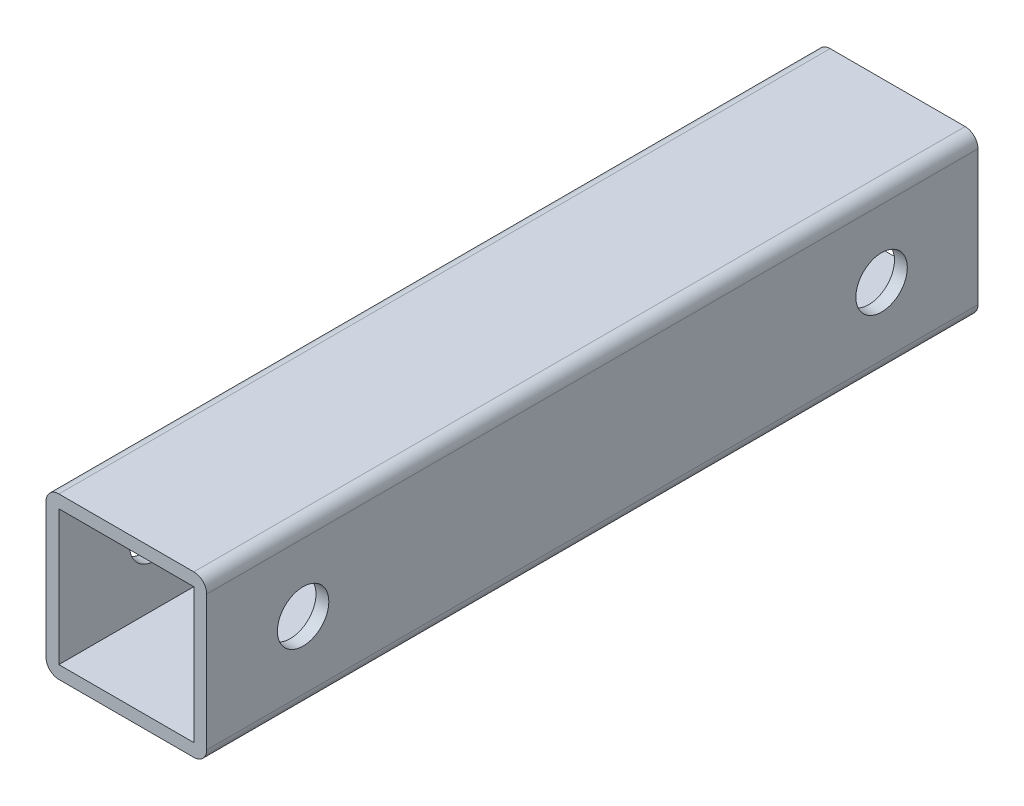
ISO-10303-21;
HEADER;
FILE_DESCRIPTION(('STEP AP214'),'2;1');
FILE_NAME('part.step','',(''),(''),'','','');
FILE_SCHEMA(('AUTOMOTIVE_DESIGN { 1 0 10303 214 1 1 1 1 }'));
ENDSEC;
DATA;
#1=APPLICATION_CONTEXT('core data for automotive mechanical design processes');
#2=APPLICATION_PROTOCOL_DEFINITION('international standard','automotive_design',2000,#1);
#3=PRODUCT_CONTEXT('',#1,'mechanical');
#4=PRODUCT('Part','Part','',(#3));
#5=PRODUCT_RELATED_PRODUCT_CATEGORY('part','',(#4));
#6=PRODUCT_DEFINITION_FORMATION('','',#4);
#7=PRODUCT_DEFINITION_CONTEXT('part definition',#1,'design');
#8=PRODUCT_DEFINITION('design','',#6,#7);
#9=PRODUCT_DEFINITION_SHAPE('','',#8);
#10=(LENGTH_UNIT() NAMED_UNIT(*) SI_UNIT(.MILLI.,.METRE.));
#11=(NAMED_UNIT(*) PLANE_ANGLE_UNIT() SI_UNIT($,.RADIAN.));
#12=(NAMED_UNIT(*) SI_UNIT($,.STERADIAN.) SOLID_ANGLE_UNIT());
#13=UNCERTAINTY_MEASURE_WITH_UNIT(LENGTH_MEASURE(1.E-05),#10,'distance_accuracy_value','');
#14=(GEOMETRIC_REPRESENTATION_CONTEXT(3) GLOBAL_UNCERTAINTY_ASSIGNED_CONTEXT((#13)) GLOBAL_UNIT_ASSIGNED_CONTEXT((#10,
#11,#12)) REPRESENTATION_CONTEXT('',''));
#15=CARTESIAN_POINT('',(0.,0.,0.));
#16=DIRECTION('',(0.,0.,1.));
#17=DIRECTION('',(1.,0.,0.));
#18=AXIS2_PLACEMENT_3D('',#15,#16,#17);
#19=CARTESIAN_POINT('',(12.5,-12.5,-60.));
#20=DIRECTION('',(1.,0.,0.));
#21=DIRECTION('',(0.,0.,-1.));
#22=AXIS2_PLACEMENT_3D('',#19,#20,#21);
#23=PLANE('',#22);
#24=CARTESIAN_POINT('',(12.5,0.,45.));
#25=DIRECTION('',(1.,0.,0.));
#26=DIRECTION('',(0.,0.,-1.));
#27=AXIS2_PLACEMENT_3D('',#24,#25,#26);
#28=CIRCLE('',#27,4.00000000000001);
#29=CARTESIAN_POINT('',(12.5,0.,41.));
#30=VERTEX_POINT('',#29);
#31=EDGE_CURVE('E280',#30,#30,#28,.T.);
#32=ORIENTED_EDGE('',*,*,#31,.F.);
#33=EDGE_LOOP('',(#32));
#34=FACE_BOUND('',#33,.T.);
#35=CARTESIAN_POINT('',(12.5,0.,-45.));
#36=DIRECTION('',(1.,0.,0.));
#37=DIRECTION('',(0.,0.,-1.));
#38=AXIS2_PLACEMENT_3D('',#35,#36,#37);
#39=CIRCLE('',#38,4.00000000000001);
#40=CARTESIAN_POINT('',(12.5,0.,-49.));
#41=VERTEX_POINT('',#40);
#42=EDGE_CURVE('E290',#41,#41,#39,.T.);
#43=ORIENTED_EDGE('',*,*,#42,.F.);
#44=EDGE_LOOP('',(#43));
#45=FACE_BOUND('',#44,.T.);
#46=DIRECTION('',(0.,1.,0.));
#47=VECTOR('',#46,1.);
#48=CARTESIAN_POINT('',(12.5,-12.5,60.));
#49=LINE('',#48,#47);
#50=CARTESIAN_POINT('',(12.5,-10.5,60.));
#51=VERTEX_POINT('',#50);
#52=CARTESIAN_POINT('',(12.5,10.5,60.));
#53=VERTEX_POINT('',#52);
#54=EDGE_CURVE('E206',#51,#53,#49,.T.);
#55=ORIENTED_EDGE('',*,*,#54,.F.);
#56=DIRECTION('',(0.,0.,1.));
#57=VECTOR('',#56,1.);
#58=CARTESIAN_POINT('',(12.5,-10.5,-60.));
#59=LINE('',#58,#57);
#60=CARTESIAN_POINT('',(12.5,-10.5,-60.));
#61=VERTEX_POINT('',#60);
#62=EDGE_CURVE('E269',#51,#61,#59,.F.);
#63=ORIENTED_EDGE('',*,*,#62,.T.);
#64=DIRECTION('',(0.,1.,0.));
#65=VECTOR('',#64,1.);
#66=CARTESIAN_POINT('',(12.5,-12.5,-60.));
#67=LINE('',#66,#65);
#68=CARTESIAN_POINT('',(12.5,10.5,-60.));
#69=VERTEX_POINT('',#68);
#70=EDGE_CURVE('E227',#61,#69,#67,.T.);
#71=ORIENTED_EDGE('',*,*,#70,.T.);
#72=DIRECTION('',(0.,0.,1.));
#73=VECTOR('',#72,1.);
#74=CARTESIAN_POINT('',(12.5,10.5,-60.));
#75=LINE('',#74,#73);
#76=EDGE_CURVE('E266',#69,#53,#75,.T.);
#77=ORIENTED_EDGE('',*,*,#76,.T.);
#78=EDGE_LOOP('',(#55,#63,#71,#77));
#79=FACE_BOUND('',#78,.T.);
#80=ADVANCED_FACE('F81',(#34,#45,#79),#23,.T.);
#81=CARTESIAN_POINT('',(-12.5,-12.5,-60.));
#82=DIRECTION('',(0.,-1.,0.));
#83=DIRECTION('',(0.,0.,-1.));
#84=AXIS2_PLACEMENT_3D('',#81,#82,#83);
#85=PLANE('',#84);
#86=DIRECTION('',(1.,0.,0.));
#87=VECTOR('',#86,1.);
#88=CARTESIAN_POINT('',(-12.5,-12.5,60.));
#89=LINE('',#88,#87);
#90=CARTESIAN_POINT('',(-10.5,-12.5,60.));
#91=VERTEX_POINT('',#90);
#92=CARTESIAN_POINT('',(10.5,-12.5,60.));
#93=VERTEX_POINT('',#92);
#94=EDGE_CURVE('E215',#91,#93,#89,.T.);
#95=ORIENTED_EDGE('',*,*,#94,.F.);
#96=DIRECTION('',(0.,0.,1.));
#97=VECTOR('',#96,1.);
#98=CARTESIAN_POINT('',(-10.5,-12.5,-60.));
#99=LINE('',#98,#97);
#100=CARTESIAN_POINT('',(-10.5,-12.5,-60.));
#101=VERTEX_POINT('',#100);
#102=EDGE_CURVE('E257',#91,#101,#99,.F.);
#103=ORIENTED_EDGE('',*,*,#102,.T.);
#104=DIRECTION('',(1.,0.,0.));
#105=VECTOR('',#104,1.);
#106=CARTESIAN_POINT('',(-12.5,-12.5,-60.));
#107=LINE('',#106,#105);
#108=CARTESIAN_POINT('',(10.5,-12.5,-60.));
#109=VERTEX_POINT('',#108);
#110=EDGE_CURVE('E238',#101,#109,#107,.T.);
#111=ORIENTED_EDGE('',*,*,#110,.T.);
#112=DIRECTION('',(0.,0.,1.));
#113=VECTOR('',#112,1.);
#114=CARTESIAN_POINT('',(10.5,-12.5,-60.));
#115=LINE('',#114,#113);
#116=EDGE_CURVE('E254',#109,#93,#115,.T.);
#117=ORIENTED_EDGE('',*,*,#116,.T.);
#118=EDGE_LOOP('',(#95,#103,#111,#117));
#119=FACE_BOUND('',#118,.T.);
#120=ADVANCED_FACE('F317',(#119),#85,.T.);
#121=CARTESIAN_POINT('',(-12.5,-12.5,-60.));
#122=DIRECTION('',(-1.,0.,0.));
#123=DIRECTION('',(0.,0.,1.));
#124=AXIS2_PLACEMENT_3D('',#121,#122,#123);
#125=PLANE('',#124);
#126=CARTESIAN_POINT('',(-12.5,0.,45.));
#127=DIRECTION('',(1.,0.,0.));
#128=DIRECTION('',(0.,0.,-1.));
#129=AXIS2_PLACEMENT_3D('',#126,#127,#128);
#130=CIRCLE('',#129,4.00000000000001);
#131=CARTESIAN_POINT('',(-12.5,0.,41.));
#132=VERTEX_POINT('',#131);
#133=EDGE_CURVE('E274',#132,#132,#130,.T.);
#134=ORIENTED_EDGE('',*,*,#133,.T.);
#135=EDGE_LOOP('',(#134));
#136=FACE_BOUND('',#135,.T.);
#137=CARTESIAN_POINT('',(-12.5,0.,-45.));
#138=DIRECTION('',(1.,0.,0.));
#139=DIRECTION('',(0.,0.,-1.));
#140=AXIS2_PLACEMENT_3D('',#137,#138,#139);
#141=CIRCLE('',#140,4.00000000000001);
#142=CARTESIAN_POINT('',(-12.5,0.,-49.));
#143=VERTEX_POINT('',#142);
#144=EDGE_CURVE('E285',#143,#143,#141,.T.);
#145=ORIENTED_EDGE('',*,*,#144,.T.);
#146=EDGE_LOOP('',(#145));
#147=FACE_BOUND('',#146,.T.);
#148=DIRECTION('',(0.,-1.,0.));
#149=VECTOR('',#148,1.);
#150=CARTESIAN_POINT('',(-12.5,-12.5,-60.));
#151=LINE('',#150,#149);
#152=CARTESIAN_POINT('',(-12.5,10.5,-60.));
#153=VERTEX_POINT('',#152);
#154=CARTESIAN_POINT('',(-12.5,-10.5,-60.));
#155=VERTEX_POINT('',#154);
#156=EDGE_CURVE('E235',#153,#155,#151,.T.);
#157=ORIENTED_EDGE('',*,*,#156,.T.);
#158=DIRECTION('',(0.,0.,1.));
#159=VECTOR('',#158,1.);
#160=CARTESIAN_POINT('',(-12.5,-10.5,-60.));
#161=LINE('',#160,#159);
#162=CARTESIAN_POINT('',(-12.5,-10.5,60.));
#163=VERTEX_POINT('',#162);
#164=EDGE_CURVE('E243',#155,#163,#161,.T.);
#165=ORIENTED_EDGE('',*,*,#164,.T.);
#166=DIRECTION('',(0.,-1.,0.));
#167=VECTOR('',#166,1.);
#168=CARTESIAN_POINT('',(-12.5,-12.5,60.));
#169=LINE('',#168,#167);
#170=CARTESIAN_POINT('',(-12.5,10.5,60.));
#171=VERTEX_POINT('',#170);
#172=EDGE_CURVE('E212',#171,#163,#169,.T.);
#173=ORIENTED_EDGE('',*,*,#172,.F.);
#174=DIRECTION('',(0.,0.,1.));
#175=VECTOR('',#174,1.);
#176=CARTESIAN_POINT('',(-12.5,10.5,-60.));
#177=LINE('',#176,#175);
#178=EDGE_CURVE('E241',#171,#153,#177,.F.);
#179=ORIENTED_EDGE('',*,*,#178,.T.);
#180=EDGE_LOOP('',(#157,#165,#173,#179));
#181=FACE_BOUND('',#180,.T.);
#182=ADVANCED_FACE('F323',(#136,#147,#181),#125,.T.);
#183=CARTESIAN_POINT('',(-12.5,12.5,-60.));
#184=DIRECTION('',(0.,1.,0.));
#185=DIRECTION('',(0.,0.,1.));
#186=AXIS2_PLACEMENT_3D('',#183,#184,#185);
#187=PLANE('',#186);
#188=DIRECTION('',(-1.,0.,0.));
#189=VECTOR('',#188,1.);
#190=CARTESIAN_POINT('',(-12.5,12.5,-60.));
#191=LINE('',#190,#189);
#192=CARTESIAN_POINT('',(10.5,12.5,-60.));
#193=VERTEX_POINT('',#192);
#194=CARTESIAN_POINT('',(-10.5,12.5,-60.));
#195=VERTEX_POINT('',#194);
#196=EDGE_CURVE('E233',#193,#195,#191,.T.);
#197=ORIENTED_EDGE('',*,*,#196,.T.);
#198=DIRECTION('',(0.,0.,1.));
#199=VECTOR('',#198,1.);
#200=CARTESIAN_POINT('',(-10.5,12.5,-60.));
#201=LINE('',#200,#199);
#202=CARTESIAN_POINT('',(-10.5,12.5,60.));
#203=VERTEX_POINT('',#202);
#204=EDGE_CURVE('E12',#195,#203,#201,.T.);
#205=ORIENTED_EDGE('',*,*,#204,.T.);
#206=DIRECTION('',(-1.,0.,0.));
#207=VECTOR('',#206,1.);
#208=CARTESIAN_POINT('',(-12.5,12.5,60.));
#209=LINE('',#208,#207);
#210=CARTESIAN_POINT('',(10.5,12.5,60.));
#211=VERTEX_POINT('',#210);
#212=EDGE_CURVE('E209',#211,#203,#209,.T.);
#213=ORIENTED_EDGE('',*,*,#212,.F.);
#214=DIRECTION('',(0.,0.,1.));
#215=VECTOR('',#214,1.);
#216=CARTESIAN_POINT('',(10.5,12.5,-60.));
#217=LINE('',#216,#215);
#218=EDGE_CURVE('E90',#211,#193,#217,.F.);
#219=ORIENTED_EDGE('',*,*,#218,.T.);
#220=EDGE_LOOP('',(#197,#205,#213,#219));
#221=FACE_BOUND('',#220,.T.);
#222=ADVANCED_FACE('F330',(#221),#187,.T.);
#223=CARTESIAN_POINT('',(0.,0.,-60.));
#224=DIRECTION('',(0.,0.,1.));
#225=DIRECTION('',(1.,0.,0.));
#226=AXIS2_PLACEMENT_3D('',#223,#224,#225);
#227=PLANE('',#226);
#228=DIRECTION('',(1.,0.,0.));
#229=VECTOR('',#228,1.);
#230=CARTESIAN_POINT('',(0.,-10.5,-60.));
#231=LINE('',#230,#229);
#232=CARTESIAN_POINT('',(-10.5,-10.5,-60.));
#233=VERTEX_POINT('',#232);
#234=CARTESIAN_POINT('',(10.5,-10.5,-60.));
#235=VERTEX_POINT('',#234);
#236=EDGE_CURVE('E186',#233,#235,#231,.T.);
#237=ORIENTED_EDGE('',*,*,#236,.T.);
#238=DIRECTION('',(0.,1.,0.));
#239=VECTOR('',#238,1.);
#240=CARTESIAN_POINT('',(10.5,0.,-60.));
#241=LINE('',#240,#239);
#242=CARTESIAN_POINT('',(10.5,10.5,-60.));
#243=VERTEX_POINT('',#242);
#244=EDGE_CURVE('E218',#235,#243,#241,.T.);
#245=ORIENTED_EDGE('',*,*,#244,.T.);
#246=DIRECTION('',(-1.,0.,0.));
#247=VECTOR('',#246,1.);
#248=CARTESIAN_POINT('',(0.,10.5,-60.));
#249=LINE('',#248,#247);
#250=CARTESIAN_POINT('',(-10.5,10.5,-60.));
#251=VERTEX_POINT('',#250);
#252=EDGE_CURVE('E181',#243,#251,#249,.T.);
#253=ORIENTED_EDGE('',*,*,#252,.T.);
#254=DIRECTION('',(0.,-1.,0.));
#255=VECTOR('',#254,1.);
#256=CARTESIAN_POINT('',(-10.5,0.,-60.));
#257=LINE('',#256,#255);
#258=EDGE_CURVE('E221',#251,#233,#257,.T.);
#259=ORIENTED_EDGE('',*,*,#258,.T.);
#260=EDGE_LOOP('',(#237,#245,#253,#259));
#261=FACE_BOUND('',#260,.T.);
#262=ORIENTED_EDGE('',*,*,#110,.F.);
#263=CARTESIAN_POINT('',(-10.5,-10.5,-60.));
#264=DIRECTION('',(0.,0.,1.));
#265=DIRECTION('',(1.,0.,0.));
#266=AXIS2_PLACEMENT_3D('',#263,#264,#265);
#267=CIRCLE('',#266,2.);
#268=EDGE_CURVE('E264',#101,#155,#267,.F.);
#269=ORIENTED_EDGE('',*,*,#268,.T.);
#270=ORIENTED_EDGE('',*,*,#156,.F.);
#271=CARTESIAN_POINT('',(-10.5,10.5,-60.));
#272=DIRECTION('',(0.,0.,1.));
#273=DIRECTION('',(1.,0.,0.));
#274=AXIS2_PLACEMENT_3D('',#271,#272,#273);
#275=CIRCLE('',#274,2.);
#276=EDGE_CURVE('E98',#153,#195,#275,.F.);
#277=ORIENTED_EDGE('',*,*,#276,.T.);
#278=ORIENTED_EDGE('',*,*,#196,.F.);
#279=CARTESIAN_POINT('',(10.5,10.5,-60.));
#280=DIRECTION('',(0.,0.,1.));
#281=DIRECTION('',(1.,0.,0.));
#282=AXIS2_PLACEMENT_3D('',#279,#280,#281);
#283=CIRCLE('',#282,2.);
#284=EDGE_CURVE('E259',#193,#69,#283,.F.);
#285=ORIENTED_EDGE('',*,*,#284,.T.);
#286=ORIENTED_EDGE('',*,*,#70,.F.);
#287=CARTESIAN_POINT('',(10.5,-10.5,-60.));
#288=DIRECTION('',(0.,0.,1.));
#289=DIRECTION('',(1.,0.,0.));
#290=AXIS2_PLACEMENT_3D('',#287,#288,#289);
#291=CIRCLE('',#290,2.);
#292=EDGE_CURVE('E262',#61,#109,#291,.F.);
#293=ORIENTED_EDGE('',*,*,#292,.T.);
#294=EDGE_LOOP('',(#262,#269,#270,#277,#278,#285,#286,#293));
#295=FACE_BOUND('',#294,.T.);
#296=ADVANCED_FACE('F358',(#261,#295),#227,.F.);
#297=CARTESIAN_POINT('',(10.5,0.,-60.));
#298=DIRECTION('',(1.,0.,0.));
#299=DIRECTION('',(0.,0.,-1.));
#300=AXIS2_PLACEMENT_3D('',#297,#298,#299);
#301=PLANE('',#300);
#302=CARTESIAN_POINT('',(10.5,0.,45.));
#303=DIRECTION('',(1.,0.,0.));
#304=DIRECTION('',(0.,0.,-1.));
#305=AXIS2_PLACEMENT_3D('',#302,#303,#304);
#306=CIRCLE('',#305,4.00000000000001);
#307=CARTESIAN_POINT('',(10.5,0.,41.));
#308=VERTEX_POINT('',#307);
#309=EDGE_CURVE('E195',#308,#308,#306,.T.);
#310=ORIENTED_EDGE('',*,*,#309,.T.);
#311=EDGE_LOOP('',(#310));
#312=FACE_BOUND('',#311,.T.);
#313=CARTESIAN_POINT('',(10.5,0.,-45.));
#314=DIRECTION('',(1.,0.,0.));
#315=DIRECTION('',(0.,0.,-1.));
#316=AXIS2_PLACEMENT_3D('',#313,#314,#315);
#317=CIRCLE('',#316,4.00000000000001);
#318=CARTESIAN_POINT('',(10.5,0.,-49.));
#319=VERTEX_POINT('',#318);
#320=EDGE_CURVE('E273',#319,#319,#317,.T.);
#321=ORIENTED_EDGE('',*,*,#320,.T.);
#322=EDGE_LOOP('',(#321));
#323=FACE_BOUND('',#322,.T.);
#324=DIRECTION('',(0.,0.,1.));
#325=VECTOR('',#324,1.);
#326=CARTESIAN_POINT('',(10.5,-10.5,-60.));
#327=LINE('',#326,#325);
#328=CARTESIAN_POINT('',(10.5,-10.5,60.));
#329=VERTEX_POINT('',#328);
#330=EDGE_CURVE('E191',#235,#329,#327,.T.);
#331=ORIENTED_EDGE('',*,*,#330,.T.);
#332=DIRECTION('',(0.,1.,0.));
#333=VECTOR('',#332,1.);
#334=CARTESIAN_POINT('',(10.5,0.,60.));
#335=LINE('',#334,#333);
#336=CARTESIAN_POINT('',(10.5,10.5,60.));
#337=VERTEX_POINT('',#336);
#338=EDGE_CURVE('E189',#329,#337,#335,.T.);
#339=ORIENTED_EDGE('',*,*,#338,.T.);
#340=DIRECTION('',(0.,0.,1.));
#341=VECTOR('',#340,1.);
#342=CARTESIAN_POINT('',(10.5,10.5,-60.));
#343=LINE('',#342,#341);
#344=EDGE_CURVE('E173',#243,#337,#343,.T.);
#345=ORIENTED_EDGE('',*,*,#344,.F.);
#346=ORIENTED_EDGE('',*,*,#244,.F.);
#347=EDGE_LOOP('',(#331,#339,#345,#346));
#348=FACE_BOUND('',#347,.T.);
#349=ADVANCED_FACE('F190',(#312,#323,#348),#301,.F.);
#350=CARTESIAN_POINT('',(0.,-10.5,-60.));
#351=DIRECTION('',(0.,-1.,0.));
#352=DIRECTION('',(0.,0.,-1.));
#353=AXIS2_PLACEMENT_3D('',#350,#351,#352);
#354=PLANE('',#353);
#355=DIRECTION('',(0.,0.,1.));
#356=VECTOR('',#355,1.);
#357=CARTESIAN_POINT('',(-10.5,-10.5,-60.));
#358=LINE('',#357,#356);
#359=CARTESIAN_POINT('',(-10.5,-10.5,60.));
#360=VERTEX_POINT('',#359);
#361=EDGE_CURVE('E228',#233,#360,#358,.T.);
#362=ORIENTED_EDGE('',*,*,#361,.T.);
#363=DIRECTION('',(1.,0.,0.));
#364=VECTOR('',#363,1.);
#365=CARTESIAN_POINT('',(0.,-10.5,60.));
#366=LINE('',#365,#364);
#367=EDGE_CURVE('E201',#360,#329,#366,.T.);
#368=ORIENTED_EDGE('',*,*,#367,.T.);
#369=ORIENTED_EDGE('',*,*,#330,.F.);
#370=ORIENTED_EDGE('',*,*,#236,.F.);
#371=EDGE_LOOP('',(#362,#368,#369,#370));
#372=FACE_BOUND('',#371,.T.);
#373=ADVANCED_FACE('F376',(#372),#354,.F.);
#374=CARTESIAN_POINT('',(-10.5,0.,-60.));
#375=DIRECTION('',(-1.,0.,0.));
#376=DIRECTION('',(0.,0.,1.));
#377=AXIS2_PLACEMENT_3D('',#374,#375,#376);
#378=PLANE('',#377);
#379=CARTESIAN_POINT('',(-10.5,0.,45.));
#380=DIRECTION('',(-1.,0.,0.));
#381=DIRECTION('',(0.,0.,1.));
#382=AXIS2_PLACEMENT_3D('',#379,#380,#381);
#383=CIRCLE('',#382,4.00000000000001);
#384=CARTESIAN_POINT('',(-10.5,0.,49.));
#385=VERTEX_POINT('',#384);
#386=EDGE_CURVE('E85',#385,#385,#383,.T.);
#387=ORIENTED_EDGE('',*,*,#386,.T.);
#388=EDGE_LOOP('',(#387));
#389=FACE_BOUND('',#388,.T.);
#390=CARTESIAN_POINT('',(-10.5,0.,-45.));
#391=DIRECTION('',(-1.,0.,0.));
#392=DIRECTION('',(0.,0.,1.));
#393=AXIS2_PLACEMENT_3D('',#390,#391,#392);
#394=CIRCLE('',#393,4.00000000000001);
#395=CARTESIAN_POINT('',(-10.5,0.,-41.));
#396=VERTEX_POINT('',#395);
#397=EDGE_CURVE('E271',#396,#396,#394,.T.);
#398=ORIENTED_EDGE('',*,*,#397,.T.);
#399=EDGE_LOOP('',(#398));
#400=FACE_BOUND('',#399,.T.);
#401=DIRECTION('',(0.,0.,1.));
#402=VECTOR('',#401,1.);
#403=CARTESIAN_POINT('',(-10.5,10.5,-60.));
#404=LINE('',#403,#402);
#405=CARTESIAN_POINT('',(-10.5,10.5,60.));
#406=VERTEX_POINT('',#405);
#407=EDGE_CURVE('E185',#251,#406,#404,.T.);
#408=ORIENTED_EDGE('',*,*,#407,.T.);
#409=DIRECTION('',(0.,-1.,0.));
#410=VECTOR('',#409,1.);
#411=CARTESIAN_POINT('',(-10.5,0.,60.));
#412=LINE('',#411,#410);
#413=EDGE_CURVE('E199',#406,#360,#412,.T.);
#414=ORIENTED_EDGE('',*,*,#413,.T.);
#415=ORIENTED_EDGE('',*,*,#361,.F.);
#416=ORIENTED_EDGE('',*,*,#258,.F.);
#417=EDGE_LOOP('',(#408,#414,#415,#416));
#418=FACE_BOUND('',#417,.T.);
#419=ADVANCED_FACE('F298',(#389,#400,#418),#378,.F.);
#420=CARTESIAN_POINT('',(0.,10.5,-60.));
#421=DIRECTION('',(0.,1.,0.));
#422=DIRECTION('',(0.,0.,1.));
#423=AXIS2_PLACEMENT_3D('',#420,#421,#422);
#424=PLANE('',#423);
#425=ORIENTED_EDGE('',*,*,#344,.T.);
#426=DIRECTION('',(-1.,0.,0.));
#427=VECTOR('',#426,1.);
#428=CARTESIAN_POINT('',(0.,10.5,60.));
#429=LINE('',#428,#427);
#430=EDGE_CURVE('E178',#337,#406,#429,.T.);
#431=ORIENTED_EDGE('',*,*,#430,.T.);
#432=ORIENTED_EDGE('',*,*,#407,.F.);
#433=ORIENTED_EDGE('',*,*,#252,.F.);
#434=EDGE_LOOP('',(#425,#431,#432,#433));
#435=FACE_BOUND('',#434,.T.);
#436=ADVANCED_FACE('F175',(#435),#424,.F.);
#437=CARTESIAN_POINT('',(0.,0.,60.));
#438=DIRECTION('',(0.,0.,1.));
#439=DIRECTION('',(1.,0.,0.));
#440=AXIS2_PLACEMENT_3D('',#437,#438,#439);
#441=PLANE('',#440);
#442=ORIENTED_EDGE('',*,*,#172,.T.);
#443=CARTESIAN_POINT('',(-10.5,-10.5,60.));
#444=DIRECTION('',(0.,0.,1.));
#445=DIRECTION('',(1.,0.,0.));
#446=AXIS2_PLACEMENT_3D('',#443,#444,#445);
#447=CIRCLE('',#446,2.);
#448=EDGE_CURVE('E252',#163,#91,#447,.T.);
#449=ORIENTED_EDGE('',*,*,#448,.T.);
#450=ORIENTED_EDGE('',*,*,#94,.T.);
#451=CARTESIAN_POINT('',(10.5,-10.5,60.));
#452=DIRECTION('',(0.,0.,1.));
#453=DIRECTION('',(1.,0.,0.));
#454=AXIS2_PLACEMENT_3D('',#451,#452,#453);
#455=CIRCLE('',#454,2.);
#456=EDGE_CURVE('E250',#93,#51,#455,.T.);
#457=ORIENTED_EDGE('',*,*,#456,.T.);
#458=ORIENTED_EDGE('',*,*,#54,.T.);
#459=CARTESIAN_POINT('',(10.5,10.5,60.));
#460=DIRECTION('',(0.,0.,1.));
#461=DIRECTION('',(1.,0.,0.));
#462=AXIS2_PLACEMENT_3D('',#459,#460,#461);
#463=CIRCLE('',#462,2.);
#464=EDGE_CURVE('E246',#53,#211,#463,.T.);
#465=ORIENTED_EDGE('',*,*,#464,.T.);
#466=ORIENTED_EDGE('',*,*,#212,.T.);
#467=CARTESIAN_POINT('',(-10.5,10.5,60.));
#468=DIRECTION('',(0.,0.,1.));
#469=DIRECTION('',(1.,0.,0.));
#470=AXIS2_PLACEMENT_3D('',#467,#468,#469);
#471=CIRCLE('',#470,2.);
#472=EDGE_CURVE('E248',#203,#171,#471,.T.);
#473=ORIENTED_EDGE('',*,*,#472,.T.);
#474=EDGE_LOOP('',(#442,#449,#450,#457,#458,#465,#466,#473));
#475=FACE_BOUND('',#474,.T.);
#476=ORIENTED_EDGE('',*,*,#430,.F.);
#477=ORIENTED_EDGE('',*,*,#338,.F.);
#478=ORIENTED_EDGE('',*,*,#367,.F.);
#479=ORIENTED_EDGE('',*,*,#413,.F.);
#480=EDGE_LOOP('',(#476,#477,#478,#479));
#481=FACE_BOUND('',#480,.T.);
#482=ADVANCED_FACE('F197',(#475,#481),#441,.T.);
#483=CARTESIAN_POINT('',(-10.5,-10.5,-60.));
#484=DIRECTION('',(0.,0.,1.));
#485=DIRECTION('',(1.,0.,0.));
#486=AXIS2_PLACEMENT_3D('',#483,#484,#485);
#487=CYLINDRICAL_SURFACE('',#486,2.);
#488=ORIENTED_EDGE('',*,*,#268,.F.);
#489=ORIENTED_EDGE('',*,*,#102,.F.);
#490=ORIENTED_EDGE('',*,*,#448,.F.);
#491=ORIENTED_EDGE('',*,*,#164,.F.);
#492=EDGE_LOOP('',(#488,#489,#490,#491));
#493=FACE_BOUND('',#492,.T.);
#494=ADVANCED_FACE('F332',(#493),#487,.T.);
#495=CARTESIAN_POINT('',(10.5,-10.5,-60.));
#496=DIRECTION('',(0.,0.,1.));
#497=DIRECTION('',(1.,0.,0.));
#498=AXIS2_PLACEMENT_3D('',#495,#496,#497);
#499=CYLINDRICAL_SURFACE('',#498,2.);
#500=ORIENTED_EDGE('',*,*,#292,.F.);
#501=ORIENTED_EDGE('',*,*,#62,.F.);
#502=ORIENTED_EDGE('',*,*,#456,.F.);
#503=ORIENTED_EDGE('',*,*,#116,.F.);
#504=EDGE_LOOP('',(#500,#501,#502,#503));
#505=FACE_BOUND('',#504,.T.);
#506=ADVANCED_FACE('F335',(#505),#499,.T.);
#507=CARTESIAN_POINT('',(-10.5,10.5,-60.));
#508=DIRECTION('',(0.,0.,1.));
#509=DIRECTION('',(1.,0.,0.));
#510=AXIS2_PLACEMENT_3D('',#507,#508,#509);
#511=CYLINDRICAL_SURFACE('',#510,2.);
#512=ORIENTED_EDGE('',*,*,#276,.F.);
#513=ORIENTED_EDGE('',*,*,#178,.F.);
#514=ORIENTED_EDGE('',*,*,#472,.F.);
#515=ORIENTED_EDGE('',*,*,#204,.F.);
#516=EDGE_LOOP('',(#512,#513,#514,#515));
#517=FACE_BOUND('',#516,.T.);
#518=ADVANCED_FACE('F338',(#517),#511,.T.);
#519=CARTESIAN_POINT('',(10.5,10.5,-60.));
#520=DIRECTION('',(0.,0.,1.));
#521=DIRECTION('',(1.,0.,0.));
#522=AXIS2_PLACEMENT_3D('',#519,#520,#521);
#523=CYLINDRICAL_SURFACE('',#522,2.);
#524=ORIENTED_EDGE('',*,*,#284,.F.);
#525=ORIENTED_EDGE('',*,*,#218,.F.);
#526=ORIENTED_EDGE('',*,*,#464,.F.);
#527=ORIENTED_EDGE('',*,*,#76,.F.);
#528=EDGE_LOOP('',(#524,#525,#526,#527));
#529=FACE_BOUND('',#528,.T.);
#530=ADVANCED_FACE('F83',(#529),#523,.T.);
#531=CARTESIAN_POINT('',(-12.5,0.,-45.));
#532=DIRECTION('',(1.,0.,0.));
#533=DIRECTION('',(0.,0.,-1.));
#534=AXIS2_PLACEMENT_3D('',#531,#532,#533);
#535=CYLINDRICAL_SURFACE('',#534,4.00000000000001);
#536=ORIENTED_EDGE('',*,*,#144,.F.);
#537=EDGE_LOOP('',(#536));
#538=FACE_BOUND('',#537,.T.);
#539=ORIENTED_EDGE('',*,*,#397,.F.);
#540=EDGE_LOOP('',(#539));
#541=FACE_BOUND('',#540,.T.);
#542=ADVANCED_FACE('F303',(#538,#541),#535,.F.);
#543=CARTESIAN_POINT('',(-12.5,0.,45.));
#544=DIRECTION('',(1.,0.,0.));
#545=DIRECTION('',(0.,0.,-1.));
#546=AXIS2_PLACEMENT_3D('',#543,#544,#545);
#547=CYLINDRICAL_SURFACE('',#546,4.00000000000001);
#548=ORIENTED_EDGE('',*,*,#133,.F.);
#549=EDGE_LOOP('',(#548));
#550=FACE_BOUND('',#549,.T.);
#551=ORIENTED_EDGE('',*,*,#386,.F.);
#552=EDGE_LOOP('',(#551));
#553=FACE_BOUND('',#552,.T.);
#554=ADVANCED_FACE('F300',(#550,#553),#547,.F.);
#555=ORIENTED_EDGE('',*,*,#42,.T.);
#556=EDGE_LOOP('',(#555));
#557=FACE_BOUND('',#556,.T.);
#558=ORIENTED_EDGE('',*,*,#320,.F.);
#559=EDGE_LOOP('',(#558));
#560=FACE_BOUND('',#559,.T.);
#561=ADVANCED_FACE('F302',(#557,#560),#535,.F.);
#562=ORIENTED_EDGE('',*,*,#31,.T.);
#563=EDGE_LOOP('',(#562));
#564=FACE_BOUND('',#563,.T.);
#565=ORIENTED_EDGE('',*,*,#309,.F.);
#566=EDGE_LOOP('',(#565));
#567=FACE_BOUND('',#566,.T.);
#568=ADVANCED_FACE('F306',(#564,#567),#547,.F.);
#569=CLOSED_SHELL('',(#80,#120,#182,#222,#296,#349,#373,#419,#436,#482,#494,#506,#518,#530,#542,
#554,#561,#568));
#570=MANIFOLD_SOLID_BREP('B2',#569);
#571=ADVANCED_BREP_SHAPE_REPRESENTATION('',(#18,#570),#14);
#572=SHAPE_DEFINITION_REPRESENTATION(#9,#571);
ENDSEC;
END-ISO-10303-21;
